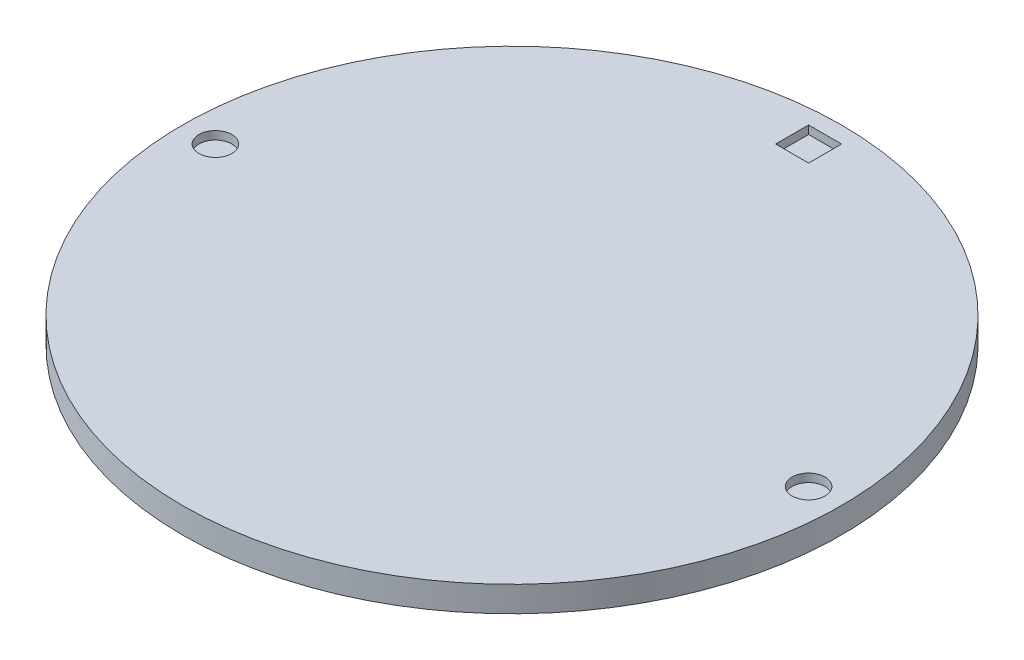
ISO-10303-21;
HEADER;
FILE_DESCRIPTION(('STEP AP214'),'2;1');
FILE_NAME('part.step','',(''),(''),'','','');
FILE_SCHEMA(('AUTOMOTIVE_DESIGN { 1 0 10303 214 1 1 1 1 }'));
ENDSEC;
DATA;
#1=APPLICATION_CONTEXT('core data for automotive mechanical design processes');
#2=APPLICATION_PROTOCOL_DEFINITION('international standard','automotive_design',2000,#1);
#3=PRODUCT_CONTEXT('',#1,'mechanical');
#4=PRODUCT('Part','Part','',(#3));
#5=PRODUCT_RELATED_PRODUCT_CATEGORY('part','',(#4));
#6=PRODUCT_DEFINITION_FORMATION('','',#4);
#7=PRODUCT_DEFINITION_CONTEXT('part definition',#1,'design');
#8=PRODUCT_DEFINITION('design','',#6,#7);
#9=PRODUCT_DEFINITION_SHAPE('','',#8);
#10=(LENGTH_UNIT() NAMED_UNIT(*) SI_UNIT(.MILLI.,.METRE.));
#11=(NAMED_UNIT(*) PLANE_ANGLE_UNIT() SI_UNIT($,.RADIAN.));
#12=(NAMED_UNIT(*) SI_UNIT($,.STERADIAN.) SOLID_ANGLE_UNIT());
#13=UNCERTAINTY_MEASURE_WITH_UNIT(LENGTH_MEASURE(1.E-05),#10,'distance_accuracy_value','');
#14=(GEOMETRIC_REPRESENTATION_CONTEXT(3) GLOBAL_UNCERTAINTY_ASSIGNED_CONTEXT((#13)) GLOBAL_UNIT_ASSIGNED_CONTEXT((#10,
#11,#12)) REPRESENTATION_CONTEXT('',''));
#15=CARTESIAN_POINT('',(0.,0.,0.));
#16=DIRECTION('',(0.,0.,1.));
#17=DIRECTION('',(1.,0.,0.));
#18=AXIS2_PLACEMENT_3D('',#15,#16,#17);
#19=CARTESIAN_POINT('',(0.,1.00000000000001,0.));
#20=DIRECTION('',(0.,1.,0.));
#21=DIRECTION('',(0.,0.,1.));
#22=AXIS2_PLACEMENT_3D('',#19,#20,#21);
#23=PLANE('',#22);
#24=CARTESIAN_POINT('',(-360.,1.00000000000001,0.));
#25=DIRECTION('',(0.,1.,0.));
#26=DIRECTION('',(0.,0.,1.));
#27=AXIS2_PLACEMENT_3D('',#24,#25,#26);
#28=CIRCLE('',#27,20.);
#29=CARTESIAN_POINT('',(-360.,1.00000000000001,20.0000000000001));
#30=VERTEX_POINT('',#29);
#31=EDGE_CURVE('E132',#30,#30,#28,.T.);
#32=ORIENTED_EDGE('',*,*,#31,.F.);
#33=EDGE_LOOP('',(#32));
#34=FACE_BOUND('',#33,.T.);
#35=CARTESIAN_POINT('',(360.,1.00000000000001,0.));
#36=DIRECTION('',(0.,1.,0.));
#37=DIRECTION('',(0.,0.,1.));
#38=AXIS2_PLACEMENT_3D('',#35,#36,#37);
#39=CIRCLE('',#38,20.);
#40=CARTESIAN_POINT('',(360.,1.00000000000001,20.));
#41=VERTEX_POINT('',#40);
#42=EDGE_CURVE('E138',#41,#41,#39,.T.);
#43=ORIENTED_EDGE('',*,*,#42,.F.);
#44=EDGE_LOOP('',(#43));
#45=FACE_BOUND('',#44,.T.);
#46=CARTESIAN_POINT('',(0.,1.00000000000001,0.));
#47=DIRECTION('',(0.,1.,0.));
#48=DIRECTION('',(0.,0.,1.));
#49=AXIS2_PLACEMENT_3D('',#46,#47,#48);
#50=CIRCLE('',#49,400.);
#51=CARTESIAN_POINT('',(0.,1.00000000000001,400.));
#52=VERTEX_POINT('',#51);
#53=EDGE_CURVE('E11',#52,#52,#50,.T.);
#54=ORIENTED_EDGE('',*,*,#53,.T.);
#55=EDGE_LOOP('',(#54));
#56=FACE_BOUND('',#55,.T.);
#57=DIRECTION('',(-1.,0.,0.));
#58=VECTOR('',#57,1.);
#59=CARTESIAN_POINT('',(20.,1.00000000000001,-380.));
#60=LINE('',#59,#58);
#61=CARTESIAN_POINT('',(20.,1.00000000000001,-380.));
#62=VERTEX_POINT('',#61);
#63=CARTESIAN_POINT('',(-20.,1.00000000000001,-380.));
#64=VERTEX_POINT('',#63);
#65=EDGE_CURVE('E102',#62,#64,#60,.T.);
#66=ORIENTED_EDGE('',*,*,#65,.F.);
#67=DIRECTION('',(0.,0.,1.));
#68=VECTOR('',#67,1.);
#69=CARTESIAN_POINT('',(20.,1.00000000000001,-380.));
#70=LINE('',#69,#68);
#71=CARTESIAN_POINT('',(20.,1.00000000000001,-340.));
#72=VERTEX_POINT('',#71);
#73=EDGE_CURVE('E55',#62,#72,#70,.T.);
#74=ORIENTED_EDGE('',*,*,#73,.T.);
#75=DIRECTION('',(-1.,0.,0.));
#76=VECTOR('',#75,1.);
#77=CARTESIAN_POINT('',(20.,1.00000000000001,-340.));
#78=LINE('',#77,#76);
#79=CARTESIAN_POINT('',(-20.,1.00000000000001,-340.));
#80=VERTEX_POINT('',#79);
#81=EDGE_CURVE('E64',#72,#80,#78,.T.);
#82=ORIENTED_EDGE('',*,*,#81,.T.);
#83=DIRECTION('',(0.,0.,1.));
#84=VECTOR('',#83,1.);
#85=CARTESIAN_POINT('',(-20.,1.00000000000001,-380.));
#86=LINE('',#85,#84);
#87=EDGE_CURVE('E92',#64,#80,#86,.T.);
#88=ORIENTED_EDGE('',*,*,#87,.F.);
#89=EDGE_LOOP('',(#66,#74,#82,#88));
#90=FACE_BOUND('',#89,.T.);
#91=ADVANCED_FACE('F39',(#34,#45,#56,#90),#23,.T.);
#92=CARTESIAN_POINT('',(0.,1.00000000000001,0.));
#93=DIRECTION('',(0.,-1.,0.));
#94=DIRECTION('',(0.,0.,-1.));
#95=AXIS2_PLACEMENT_3D('',#92,#93,#94);
#96=CYLINDRICAL_SURFACE('',#95,400.);
#97=ORIENTED_EDGE('',*,*,#53,.F.);
#98=EDGE_LOOP('',(#97));
#99=FACE_BOUND('',#98,.T.);
#100=CARTESIAN_POINT('',(0.,-30.,0.));
#101=DIRECTION('',(0.,1.,0.));
#102=DIRECTION('',(0.,0.,1.));
#103=AXIS2_PLACEMENT_3D('',#100,#101,#102);
#104=CIRCLE('',#103,400.);
#105=CARTESIAN_POINT('',(0.,-30.,400.));
#106=VERTEX_POINT('',#105);
#107=EDGE_CURVE('E48',#106,#106,#104,.T.);
#108=ORIENTED_EDGE('',*,*,#107,.T.);
#109=EDGE_LOOP('',(#108));
#110=FACE_BOUND('',#109,.T.);
#111=ADVANCED_FACE('F41',(#99,#110),#96,.T.);
#112=CARTESIAN_POINT('',(0.,-30.,0.));
#113=DIRECTION('',(0.,1.,0.));
#114=DIRECTION('',(0.,0.,1.));
#115=AXIS2_PLACEMENT_3D('',#112,#113,#114);
#116=PLANE('',#115);
#117=ORIENTED_EDGE('',*,*,#107,.F.);
#118=EDGE_LOOP('',(#117));
#119=FACE_BOUND('',#118,.T.);
#120=ADVANCED_FACE('F156',(#119),#116,.F.);
#121=CARTESIAN_POINT('',(20.,-8.99999999999999,-380.));
#122=DIRECTION('',(-1.,0.,0.));
#123=DIRECTION('',(0.,0.,1.));
#124=AXIS2_PLACEMENT_3D('',#121,#122,#123);
#125=PLANE('',#124);
#126=ORIENTED_EDGE('',*,*,#73,.F.);
#127=DIRECTION('',(0.,1.,0.));
#128=VECTOR('',#127,1.);
#129=CARTESIAN_POINT('',(20.,-8.99999999999999,-380.));
#130=LINE('',#129,#128);
#131=CARTESIAN_POINT('',(20.,-8.99999999999999,-380.));
#132=VERTEX_POINT('',#131);
#133=EDGE_CURVE('E98',#132,#62,#130,.T.);
#134=ORIENTED_EDGE('',*,*,#133,.F.);
#135=DIRECTION('',(0.,0.,1.));
#136=VECTOR('',#135,1.);
#137=CARTESIAN_POINT('',(20.,-8.99999999999999,-380.));
#138=LINE('',#137,#136);
#139=CARTESIAN_POINT('',(20.,-8.99999999999999,-340.));
#140=VERTEX_POINT('',#139);
#141=EDGE_CURVE('E106',#132,#140,#138,.T.);
#142=ORIENTED_EDGE('',*,*,#141,.T.);
#143=DIRECTION('',(0.,1.,0.));
#144=VECTOR('',#143,1.);
#145=CARTESIAN_POINT('',(20.,-8.99999999999999,-340.));
#146=LINE('',#145,#144);
#147=EDGE_CURVE('E147',#140,#72,#146,.T.);
#148=ORIENTED_EDGE('',*,*,#147,.T.);
#149=EDGE_LOOP('',(#126,#134,#142,#148));
#150=FACE_BOUND('',#149,.T.);
#151=ADVANCED_FACE('F154',(#150),#125,.T.);
#152=CARTESIAN_POINT('',(20.,-8.99999999999999,-340.));
#153=DIRECTION('',(0.,0.,-1.));
#154=DIRECTION('',(-1.,0.,0.));
#155=AXIS2_PLACEMENT_3D('',#152,#153,#154);
#156=PLANE('',#155);
#157=ORIENTED_EDGE('',*,*,#81,.F.);
#158=ORIENTED_EDGE('',*,*,#147,.F.);
#159=DIRECTION('',(-1.,0.,0.));
#160=VECTOR('',#159,1.);
#161=CARTESIAN_POINT('',(20.,-8.99999999999999,-340.));
#162=LINE('',#161,#160);
#163=CARTESIAN_POINT('',(-20.,-8.99999999999999,-340.));
#164=VERTEX_POINT('',#163);
#165=EDGE_CURVE('E81',#140,#164,#162,.T.);
#166=ORIENTED_EDGE('',*,*,#165,.T.);
#167=DIRECTION('',(0.,1.,0.));
#168=VECTOR('',#167,1.);
#169=CARTESIAN_POINT('',(-20.,-8.99999999999999,-340.));
#170=LINE('',#169,#168);
#171=EDGE_CURVE('E99',#164,#80,#170,.T.);
#172=ORIENTED_EDGE('',*,*,#171,.T.);
#173=EDGE_LOOP('',(#157,#158,#166,#172));
#174=FACE_BOUND('',#173,.T.);
#175=ADVANCED_FACE('F152',(#174),#156,.T.);
#176=CARTESIAN_POINT('',(-20.,-8.99999999999999,-380.));
#177=DIRECTION('',(-1.,0.,0.));
#178=DIRECTION('',(0.,0.,1.));
#179=AXIS2_PLACEMENT_3D('',#176,#177,#178);
#180=PLANE('',#179);
#181=ORIENTED_EDGE('',*,*,#87,.T.);
#182=ORIENTED_EDGE('',*,*,#171,.F.);
#183=DIRECTION('',(0.,0.,1.));
#184=VECTOR('',#183,1.);
#185=CARTESIAN_POINT('',(-20.,-8.99999999999999,-380.));
#186=LINE('',#185,#184);
#187=CARTESIAN_POINT('',(-20.,-8.99999999999999,-380.));
#188=VERTEX_POINT('',#187);
#189=EDGE_CURVE('E93',#188,#164,#186,.T.);
#190=ORIENTED_EDGE('',*,*,#189,.F.);
#191=DIRECTION('',(0.,1.,0.));
#192=VECTOR('',#191,1.);
#193=CARTESIAN_POINT('',(-20.,-8.99999999999999,-380.));
#194=LINE('',#193,#192);
#195=EDGE_CURVE('E87',#188,#64,#194,.T.);
#196=ORIENTED_EDGE('',*,*,#195,.T.);
#197=EDGE_LOOP('',(#181,#182,#190,#196));
#198=FACE_BOUND('',#197,.T.);
#199=ADVANCED_FACE('F89',(#198),#180,.F.);
#200=CARTESIAN_POINT('',(20.,-8.99999999999999,-380.));
#201=DIRECTION('',(0.,0.,-1.));
#202=DIRECTION('',(-1.,0.,0.));
#203=AXIS2_PLACEMENT_3D('',#200,#201,#202);
#204=PLANE('',#203);
#205=ORIENTED_EDGE('',*,*,#65,.T.);
#206=ORIENTED_EDGE('',*,*,#195,.F.);
#207=DIRECTION('',(-1.,0.,0.));
#208=VECTOR('',#207,1.);
#209=CARTESIAN_POINT('',(20.,-8.99999999999999,-380.));
#210=LINE('',#209,#208);
#211=EDGE_CURVE('E117',#132,#188,#210,.T.);
#212=ORIENTED_EDGE('',*,*,#211,.F.);
#213=ORIENTED_EDGE('',*,*,#133,.T.);
#214=EDGE_LOOP('',(#205,#206,#212,#213));
#215=FACE_BOUND('',#214,.T.);
#216=ADVANCED_FACE('F103',(#215),#204,.F.);
#217=CARTESIAN_POINT('',(0.,-8.99999999999999,0.));
#218=DIRECTION('',(0.,-1.,0.));
#219=DIRECTION('',(0.,0.,-1.));
#220=AXIS2_PLACEMENT_3D('',#217,#218,#219);
#221=PLANE('',#220);
#222=ORIENTED_EDGE('',*,*,#141,.F.);
#223=ORIENTED_EDGE('',*,*,#211,.T.);
#224=ORIENTED_EDGE('',*,*,#189,.T.);
#225=ORIENTED_EDGE('',*,*,#165,.F.);
#226=EDGE_LOOP('',(#222,#223,#224,#225));
#227=FACE_BOUND('',#226,.T.);
#228=ADVANCED_FACE('F153',(#227),#221,.F.);
#229=CARTESIAN_POINT('',(360.,-8.99999999999999,0.));
#230=DIRECTION('',(0.,1.,0.));
#231=DIRECTION('',(0.,0.,1.));
#232=AXIS2_PLACEMENT_3D('',#229,#230,#231);
#233=CYLINDRICAL_SURFACE('',#232,20.);
#234=CARTESIAN_POINT('',(360.,-8.99999999999999,0.));
#235=DIRECTION('',(0.,1.,0.));
#236=DIRECTION('',(0.,0.,1.));
#237=AXIS2_PLACEMENT_3D('',#234,#235,#236);
#238=CIRCLE('',#237,20.);
#239=CARTESIAN_POINT('',(360.,-8.99999999999999,20.));
#240=VERTEX_POINT('',#239);
#241=EDGE_CURVE('E116',#240,#240,#238,.T.);
#242=ORIENTED_EDGE('',*,*,#241,.F.);
#243=EDGE_LOOP('',(#242));
#244=FACE_BOUND('',#243,.T.);
#245=ORIENTED_EDGE('',*,*,#42,.T.);
#246=EDGE_LOOP('',(#245));
#247=FACE_BOUND('',#246,.T.);
#248=ADVANCED_FACE('F177',(#244,#247),#233,.F.);
#249=CARTESIAN_POINT('',(360.,-8.99999999999999,0.));
#250=DIRECTION('',(0.,1.,0.));
#251=DIRECTION('',(0.,0.,1.));
#252=AXIS2_PLACEMENT_3D('',#249,#250,#251);
#253=PLANE('',#252);
#254=ORIENTED_EDGE('',*,*,#241,.T.);
#255=EDGE_LOOP('',(#254));
#256=FACE_BOUND('',#255,.T.);
#257=ADVANCED_FACE('F199',(#256),#253,.T.);
#258=CARTESIAN_POINT('',(-360.,-8.99999999999999,0.));
#259=DIRECTION('',(0.,1.,0.));
#260=DIRECTION('',(0.,0.,1.));
#261=AXIS2_PLACEMENT_3D('',#258,#259,#260);
#262=CYLINDRICAL_SURFACE('',#261,20.);
#263=CARTESIAN_POINT('',(-360.,-8.99999999999999,0.));
#264=DIRECTION('',(0.,1.,0.));
#265=DIRECTION('',(0.,0.,1.));
#266=AXIS2_PLACEMENT_3D('',#263,#264,#265);
#267=CIRCLE('',#266,20.);
#268=CARTESIAN_POINT('',(-360.,-8.99999999999999,20.0000000000001));
#269=VERTEX_POINT('',#268);
#270=EDGE_CURVE('E127',#269,#269,#267,.T.);
#271=ORIENTED_EDGE('',*,*,#270,.F.);
#272=EDGE_LOOP('',(#271));
#273=FACE_BOUND('',#272,.T.);
#274=ORIENTED_EDGE('',*,*,#31,.T.);
#275=EDGE_LOOP('',(#274));
#276=FACE_BOUND('',#275,.T.);
#277=ADVANCED_FACE('F207',(#273,#276),#262,.F.);
#278=CARTESIAN_POINT('',(-360.,-8.99999999999999,0.));
#279=DIRECTION('',(0.,1.,0.));
#280=DIRECTION('',(0.,0.,1.));
#281=AXIS2_PLACEMENT_3D('',#278,#279,#280);
#282=PLANE('',#281);
#283=ORIENTED_EDGE('',*,*,#270,.T.);
#284=EDGE_LOOP('',(#283));
#285=FACE_BOUND('',#284,.T.);
#286=ADVANCED_FACE('F214',(#285),#282,.T.);
#287=CLOSED_SHELL('',(#91,#111,#120,#151,#175,#199,#216,#228,#248,#257,#277,#286));
#288=MANIFOLD_SOLID_BREP('B2',#287);
#289=ADVANCED_BREP_SHAPE_REPRESENTATION('',(#18,#288),#14);
#290=SHAPE_DEFINITION_REPRESENTATION(#9,#289);
ENDSEC;
END-ISO-10303-21;
